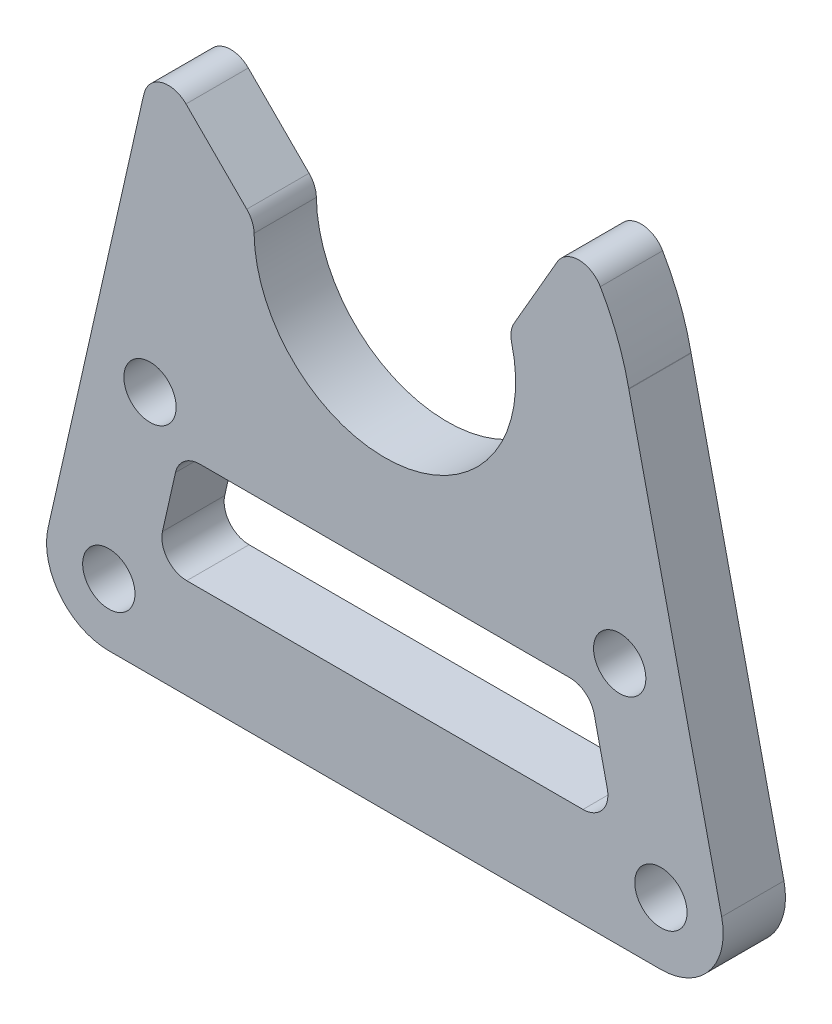
ISO-10303-21;
HEADER;
FILE_DESCRIPTION(('STEP AP214'),'2;1');
FILE_NAME('part.step','',(''),(''),'','','');
FILE_SCHEMA(('AUTOMOTIVE_DESIGN { 1 0 10303 214 1 1 1 1 }'));
ENDSEC;
DATA;
#1=APPLICATION_CONTEXT('core data for automotive mechanical design processes');
#2=APPLICATION_PROTOCOL_DEFINITION('international standard','automotive_design',2000,#1);
#3=PRODUCT_CONTEXT('',#1,'mechanical');
#4=PRODUCT('Part','Part','',(#3));
#5=PRODUCT_RELATED_PRODUCT_CATEGORY('part','',(#4));
#6=PRODUCT_DEFINITION_FORMATION('','',#4);
#7=PRODUCT_DEFINITION_CONTEXT('part definition',#1,'design');
#8=PRODUCT_DEFINITION('design','',#6,#7);
#9=PRODUCT_DEFINITION_SHAPE('','',#8);
#10=(LENGTH_UNIT() NAMED_UNIT(*) SI_UNIT(.MILLI.,.METRE.));
#11=(NAMED_UNIT(*) PLANE_ANGLE_UNIT() SI_UNIT($,.RADIAN.));
#12=(NAMED_UNIT(*) SI_UNIT($,.STERADIAN.) SOLID_ANGLE_UNIT());
#13=UNCERTAINTY_MEASURE_WITH_UNIT(LENGTH_MEASURE(1.E-05),#10,'distance_accuracy_value','');
#14=(GEOMETRIC_REPRESENTATION_CONTEXT(3) GLOBAL_UNCERTAINTY_ASSIGNED_CONTEXT((#13)) GLOBAL_UNIT_ASSIGNED_CONTEXT((#10,
#11,#12)) REPRESENTATION_CONTEXT('',''));
#15=CARTESIAN_POINT('',(0.,0.,0.));
#16=DIRECTION('',(0.,0.,1.));
#17=DIRECTION('',(1.,0.,0.));
#18=AXIS2_PLACEMENT_3D('',#15,#16,#17);
#19=CARTESIAN_POINT('',(0.,0.,5.));
#20=DIRECTION('',(0.,0.,1.));
#21=DIRECTION('',(1.,0.,0.));
#22=AXIS2_PLACEMENT_3D('',#19,#20,#21);
#23=PLANE('',#22);
#24=CARTESIAN_POINT('',(-22.1588204266534,-30.,5.));
#25=DIRECTION('',(0.,0.,1.));
#26=DIRECTION('',(1.,0.,0.));
#27=AXIS2_PLACEMENT_3D('',#24,#25,#26);
#28=CIRCLE('',#27,2.1);
#29=CARTESIAN_POINT('',(-20.0588204266534,-30.,5.));
#30=VERTEX_POINT('',#29);
#31=EDGE_CURVE('E371',#30,#30,#28,.T.);
#32=ORIENTED_EDGE('',*,*,#31,.F.);
#33=EDGE_LOOP('',(#32));
#34=FACE_BOUND('',#33,.T.);
#35=CARTESIAN_POINT('',(-18.850745921435,-15.3693252695604,5.));
#36=DIRECTION('',(0.,0.,1.));
#37=DIRECTION('',(1.,0.,0.));
#38=AXIS2_PLACEMENT_3D('',#35,#36,#37);
#39=CIRCLE('',#38,2.1);
#40=CARTESIAN_POINT('',(-16.750745921435,-15.3693252695604,5.));
#41=VERTEX_POINT('',#40);
#42=EDGE_CURVE('E377',#41,#41,#39,.T.);
#43=ORIENTED_EDGE('',*,*,#42,.F.);
#44=EDGE_LOOP('',(#43));
#45=FACE_BOUND('',#44,.T.);
#46=CARTESIAN_POINT('',(18.8507459214357,-15.3693252695604,5.));
#47=DIRECTION('',(0.,0.,1.));
#48=DIRECTION('',(1.,0.,0.));
#49=AXIS2_PLACEMENT_3D('',#46,#47,#48);
#50=CIRCLE('',#49,2.1);
#51=CARTESIAN_POINT('',(20.9507459214357,-15.3693252695604,5.));
#52=VERTEX_POINT('',#51);
#53=EDGE_CURVE('E355',#52,#52,#50,.T.);
#54=ORIENTED_EDGE('',*,*,#53,.F.);
#55=EDGE_LOOP('',(#54));
#56=FACE_BOUND('',#55,.T.);
#57=DIRECTION('',(-0.220538300347892,-0.975378315362641,0.));
#58=VECTOR('',#57,1.);
#59=CARTESIAN_POINT('',(-18.4047745929788,-27.,5.));
#60=LINE('',#59,#58);
#61=CARTESIAN_POINT('',(-16.8058134570921,-19.9282486688646,5.));
#62=VERTEX_POINT('',#61);
#63=CARTESIAN_POINT('',(-17.8528340012544,-24.5589233993042,5.));
#64=VERTEX_POINT('',#63);
#65=EDGE_CURVE('E326',#62,#64,#60,.T.);
#66=ORIENTED_EDGE('',*,*,#65,.F.);
#67=CARTESIAN_POINT('',(-14.8550568263668,-20.3693252695604,5.));
#68=DIRECTION('',(0.,0.,1.));
#69=DIRECTION('',(1.,0.,0.));
#70=AXIS2_PLACEMENT_3D('',#67,#68,#69);
#71=CIRCLE('',#70,2.);
#72=CARTESIAN_POINT('',(-14.8550568263668,-18.3693252695604,5.));
#73=VERTEX_POINT('',#72);
#74=EDGE_CURVE('E45',#62,#73,#71,.F.);
#75=ORIENTED_EDGE('',*,*,#74,.T.);
#76=DIRECTION('',(-1.,0.,0.));
#77=VECTOR('',#76,1.);
#78=CARTESIAN_POINT('',(-16.4533324643941,-18.3693252695604,5.));
#79=LINE('',#78,#77);
#80=CARTESIAN_POINT('',(14.8550568263675,-18.3693252695604,5.));
#81=VERTEX_POINT('',#80);
#82=EDGE_CURVE('E324',#81,#73,#79,.T.);
#83=ORIENTED_EDGE('',*,*,#82,.F.);
#84=CARTESIAN_POINT('',(14.8550568263675,-20.3693252695604,5.));
#85=DIRECTION('',(0.,0.,1.));
#86=DIRECTION('',(1.,0.,0.));
#87=AXIS2_PLACEMENT_3D('',#84,#85,#86);
#88=CIRCLE('',#87,2.);
#89=CARTESIAN_POINT('',(16.8058134570927,-19.9282486688646,5.));
#90=VERTEX_POINT('',#89);
#91=EDGE_CURVE('E308',#81,#90,#88,.F.);
#92=ORIENTED_EDGE('',*,*,#91,.T.);
#93=DIRECTION('',(-0.220538300347893,0.97537831536264,0.));
#94=VECTOR('',#93,1.);
#95=CARTESIAN_POINT('',(18.4047745929795,-27.,5.));
#96=LINE('',#95,#94);
#97=CARTESIAN_POINT('',(17.852834001255,-24.5589233993042,5.));
#98=VERTEX_POINT('',#97);
#99=EDGE_CURVE('E336',#98,#90,#96,.T.);
#100=ORIENTED_EDGE('',*,*,#99,.F.);
#101=CARTESIAN_POINT('',(15.9020773705297,-25.,5.));
#102=DIRECTION('',(0.,0.,1.));
#103=DIRECTION('',(1.,0.,0.));
#104=AXIS2_PLACEMENT_3D('',#101,#102,#103);
#105=CIRCLE('',#104,2.);
#106=CARTESIAN_POINT('',(15.9020773705297,-27.,5.));
#107=VERTEX_POINT('',#106);
#108=EDGE_CURVE('E312',#98,#107,#105,.F.);
#109=ORIENTED_EDGE('',*,*,#108,.T.);
#110=DIRECTION('',(1.,0.,0.));
#111=VECTOR('',#110,1.);
#112=CARTESIAN_POINT('',(18.4047745929795,-27.,5.));
#113=LINE('',#112,#111);
#114=CARTESIAN_POINT('',(-15.9020773705291,-27.,5.));
#115=VERTEX_POINT('',#114);
#116=EDGE_CURVE('E361',#115,#107,#113,.T.);
#117=ORIENTED_EDGE('',*,*,#116,.F.);
#118=CARTESIAN_POINT('',(-15.9020773705291,-25.,5.));
#119=DIRECTION('',(0.,0.,1.));
#120=DIRECTION('',(1.,0.,0.));
#121=AXIS2_PLACEMENT_3D('',#118,#119,#120);
#122=CIRCLE('',#121,2.);
#123=EDGE_CURVE('E316',#115,#64,#122,.F.);
#124=ORIENTED_EDGE('',*,*,#123,.T.);
#125=EDGE_LOOP('',(#66,#75,#83,#92,#100,#109,#117,#124));
#126=FACE_BOUND('',#125,.T.);
#127=CARTESIAN_POINT('',(22.1588204266541,-30.,5.));
#128=DIRECTION('',(0.,0.,1.));
#129=DIRECTION('',(1.,0.,0.));
#130=AXIS2_PLACEMENT_3D('',#127,#128,#129);
#131=CIRCLE('',#130,2.1);
#132=CARTESIAN_POINT('',(24.2588204266541,-30.,5.));
#133=VERTEX_POINT('',#132);
#134=EDGE_CURVE('E370',#133,#133,#131,.T.);
#135=ORIENTED_EDGE('',*,*,#134,.F.);
#136=EDGE_LOOP('',(#135));
#137=FACE_BOUND('',#136,.T.);
#138=DIRECTION('',(-0.707106781186551,0.707106781186544,0.));
#139=VECTOR('',#138,1.);
#140=CARTESIAN_POINT('',(-4.92499873096428,-4.92499873096433,5.));
#141=LINE('',#140,#139);
#142=CARTESIAN_POINT('',(-11.0844944489594,1.23449698703074,5.));
#143=VERTEX_POINT('',#142);
#144=CARTESIAN_POINT('',(-15.9619542667994,6.11195680487066,5.));
#145=VERTEX_POINT('',#144);
#146=EDGE_CURVE('E475',#143,#145,#141,.T.);
#147=ORIENTED_EDGE('',*,*,#146,.T.);
#148=CARTESIAN_POINT('',(-17.3761678291725,4.69774324249756,5.));
#149=DIRECTION('',(0.,0.,1.));
#150=DIRECTION('',(1.,0.,0.));
#151=AXIS2_PLACEMENT_3D('',#148,#149,#150);
#152=CIRCLE('',#151,2.);
#153=CARTESIAN_POINT('',(-19.306853143525,5.21971471388618,5.));
#154=VERTEX_POINT('',#153);
#155=EDGE_CURVE('E247',#145,#154,#152,.T.);
#156=ORIENTED_EDGE('',*,*,#155,.T.);
#157=CARTESIAN_POINT('',(0.,0.,5.));
#158=DIRECTION('',(0.,0.,1.));
#159=DIRECTION('',(1.,0.,0.));
#160=AXIS2_PLACEMENT_3D('',#157,#158,#159);
#161=CIRCLE('',#160,20.);
#162=CARTESIAN_POINT('',(-19.5767934974094,4.09257331758255,5.));
#163=VERTEX_POINT('',#162);
#164=EDGE_CURVE('E403',#154,#163,#161,.T.);
#165=ORIENTED_EDGE('',*,*,#164,.T.);
#166=CARTESIAN_POINT('',(-21.5344728471503,4.5018306493408,5.));
#167=DIRECTION('',(0.,0.,1.));
#168=DIRECTION('',(1.,0.,0.));
#169=AXIS2_PLACEMENT_3D('',#166,#167,#168);
#170=CIRCLE('',#169,2.);
#171=CARTESIAN_POINT('',(-19.5837162164251,4.06075404864502,5.));
#172=VERTEX_POINT('',#171);
#173=EDGE_CURVE('E301',#163,#172,#170,.F.);
#174=ORIENTED_EDGE('',*,*,#173,.T.);
#175=DIRECTION('',(-0.220538300347892,-0.975378315362641,0.));
#176=VECTOR('',#175,1.);
#177=CARTESIAN_POINT('',(-19.5047220336002,4.41012290133699,5.));
#178=LINE('',#177,#176);
#179=CARTESIAN_POINT('',(-27.0357120034666,-28.8973084982605,5.));
#180=VERTEX_POINT('',#179);
#181=EDGE_CURVE('E386',#172,#180,#178,.T.);
#182=ORIENTED_EDGE('',*,*,#181,.T.);
#183=CARTESIAN_POINT('',(-22.1588204266534,-30.,5.));
#184=DIRECTION('',(0.,0.,1.));
#185=DIRECTION('',(1.,0.,0.));
#186=AXIS2_PLACEMENT_3D('',#183,#184,#185);
#187=CIRCLE('',#186,5.);
#188=CARTESIAN_POINT('',(-22.1588204266534,-35.,5.));
#189=VERTEX_POINT('',#188);
#190=EDGE_CURVE('E408',#180,#189,#187,.T.);
#191=ORIENTED_EDGE('',*,*,#190,.T.);
#192=DIRECTION('',(-1.,0.,0.));
#193=VECTOR('',#192,1.);
#194=CARTESIAN_POINT('',(0.,-35.,5.));
#195=LINE('',#194,#193);
#196=CARTESIAN_POINT('',(22.1588204266541,-35.,5.));
#197=VERTEX_POINT('',#196);
#198=EDGE_CURVE('E208',#197,#189,#195,.T.);
#199=ORIENTED_EDGE('',*,*,#198,.F.);
#200=CARTESIAN_POINT('',(22.1588204266541,-30.,5.));
#201=DIRECTION('',(0.,0.,1.));
#202=DIRECTION('',(1.,0.,0.));
#203=AXIS2_PLACEMENT_3D('',#200,#201,#202);
#204=CIRCLE('',#203,5.);
#205=CARTESIAN_POINT('',(27.0357120034673,-28.8973084982605,5.));
#206=VERTEX_POINT('',#205);
#207=EDGE_CURVE('E231',#197,#206,#204,.T.);
#208=ORIENTED_EDGE('',*,*,#207,.T.);
#209=DIRECTION('',(-0.220538300347893,0.975378315362641,0.));
#210=VECTOR('',#209,1.);
#211=CARTESIAN_POINT('',(19.5047220336008,4.41012290133714,5.));
#212=LINE('',#211,#210);
#213=CARTESIAN_POINT('',(19.5837162164169,4.06075404868399,5.));
#214=VERTEX_POINT('',#213);
#215=EDGE_CURVE('E389',#206,#214,#212,.T.);
#216=ORIENTED_EDGE('',*,*,#215,.T.);
#217=CARTESIAN_POINT('',(21.5344728471422,4.50183064937978,5.));
#218=DIRECTION('',(0.,0.,1.));
#219=DIRECTION('',(1.,0.,0.));
#220=AXIS2_PLACEMENT_3D('',#217,#218,#219);
#221=CIRCLE('',#220,2.);
#222=CARTESIAN_POINT('',(19.576793497402,4.09257331761798,5.));
#223=VERTEX_POINT('',#222);
#224=EDGE_CURVE('E305',#214,#223,#221,.F.);
#225=ORIENTED_EDGE('',*,*,#224,.T.);
#226=CARTESIAN_POINT('',(17.2980264977454,10.0388385425456,5.));
#227=VERTEX_POINT('',#226);
#228=EDGE_CURVE('E213',#223,#227,#161,.T.);
#229=ORIENTED_EDGE('',*,*,#228,.T.);
#230=CARTESIAN_POINT('',(15.5682238479708,9.03495468829103,5.));
#231=DIRECTION('',(0.,0.,1.));
#232=DIRECTION('',(1.,0.,0.));
#233=AXIS2_PLACEMENT_3D('',#230,#231,#232);
#234=CIRCLE('',#233,2.);
#235=CARTESIAN_POINT('',(13.836173040402,10.034954688291,5.));
#236=VERTEX_POINT('',#235);
#237=EDGE_CURVE('E245',#227,#236,#234,.T.);
#238=ORIENTED_EDGE('',*,*,#237,.T.);
#239=DIRECTION('',(0.499999999999998,0.86602540378444,0.));
#240=VECTOR('',#239,1.);
#241=CARTESIAN_POINT('',(6.03186693735862,-3.48249999999998,5.));
#242=LINE('',#241,#240);
#243=CARTESIAN_POINT('',(10.3872881282424,4.06131079097298,5.));
#244=VERTEX_POINT('',#243);
#245=EDGE_CURVE('E478',#244,#236,#242,.T.);
#246=ORIENTED_EDGE('',*,*,#245,.F.);
#247=CARTESIAN_POINT('',(12.1193389358113,3.06131079097299,5.));
#248=DIRECTION('',(0.,0.,1.));
#249=DIRECTION('',(1.,0.,0.));
#250=AXIS2_PLACEMENT_3D('',#247,#248,#249);
#251=CIRCLE('',#250,2.);
#252=CARTESIAN_POINT('',(10.1802447060815,2.57150106441731,5.));
#253=VERTEX_POINT('',#252);
#254=EDGE_CURVE('E243',#244,#253,#251,.T.);
#255=ORIENTED_EDGE('',*,*,#254,.T.);
#256=CARTESIAN_POINT('',(0.,0.,5.));
#257=DIRECTION('',(0.,0.,1.));
#258=DIRECTION('',(1.,0.,0.));
#259=AXIS2_PLACEMENT_3D('',#256,#257,#258);
#260=CIRCLE('',#259,10.5);
#261=CARTESIAN_POINT('',(-10.4989147295193,-0.150961923287583,5.));
#262=VERTEX_POINT('',#261);
#263=EDGE_CURVE('E395',#262,#253,#260,.T.);
#264=ORIENTED_EDGE('',*,*,#263,.F.);
#265=CARTESIAN_POINT('',(-12.4987080113325,-0.17971657534236,5.));
#266=DIRECTION('',(0.,0.,1.));
#267=DIRECTION('',(1.,0.,0.));
#268=AXIS2_PLACEMENT_3D('',#265,#266,#267);
#269=CIRCLE('',#268,2.);
#270=EDGE_CURVE('E241',#262,#143,#269,.T.);
#271=ORIENTED_EDGE('',*,*,#270,.T.);
#272=EDGE_LOOP('',(#147,#156,#165,#174,#182,#191,#199,#208,#216,#225,#229,#238,#246,#255,#264,#271));
#273=FACE_BOUND('',#272,.T.);
#274=ADVANCED_FACE('F37',(#34,#45,#56,#126,#137,#273),#23,.T.);
#275=CARTESIAN_POINT('',(0.,0.,0.));
#276=DIRECTION('',(0.,0.,1.));
#277=DIRECTION('',(1.,0.,0.));
#278=AXIS2_PLACEMENT_3D('',#275,#276,#277);
#279=PLANE('',#278);
#280=CARTESIAN_POINT('',(22.1588204266541,-30.,0.));
#281=DIRECTION('',(0.,0.,1.));
#282=DIRECTION('',(1.,0.,0.));
#283=AXIS2_PLACEMENT_3D('',#280,#281,#282);
#284=CIRCLE('',#283,2.1);
#285=CARTESIAN_POINT('',(24.2588204266541,-30.,0.));
#286=VERTEX_POINT('',#285);
#287=EDGE_CURVE('E381',#286,#286,#284,.T.);
#288=ORIENTED_EDGE('',*,*,#287,.T.);
#289=EDGE_LOOP('',(#288));
#290=FACE_BOUND('',#289,.T.);
#291=DIRECTION('',(-0.220538300347893,0.97537831536264,0.));
#292=VECTOR('',#291,1.);
#293=CARTESIAN_POINT('',(18.4047745929795,-27.,0.));
#294=LINE('',#293,#292);
#295=CARTESIAN_POINT('',(17.852834001255,-24.5589233993042,0.));
#296=VERTEX_POINT('',#295);
#297=CARTESIAN_POINT('',(16.8058134570927,-19.9282486688646,0.));
#298=VERTEX_POINT('',#297);
#299=EDGE_CURVE('E352',#296,#298,#294,.T.);
#300=ORIENTED_EDGE('',*,*,#299,.T.);
#301=CARTESIAN_POINT('',(14.8550568263675,-20.3693252695604,0.));
#302=DIRECTION('',(0.,0.,1.));
#303=DIRECTION('',(1.,0.,0.));
#304=AXIS2_PLACEMENT_3D('',#301,#302,#303);
#305=CIRCLE('',#304,2.);
#306=CARTESIAN_POINT('',(14.8550568263675,-18.3693252695604,0.));
#307=VERTEX_POINT('',#306);
#308=EDGE_CURVE('E310',#298,#307,#305,.T.);
#309=ORIENTED_EDGE('',*,*,#308,.T.);
#310=DIRECTION('',(-1.,0.,0.));
#311=VECTOR('',#310,1.);
#312=CARTESIAN_POINT('',(-16.4533324643941,-18.3693252695604,0.));
#313=LINE('',#312,#311);
#314=CARTESIAN_POINT('',(-14.8550568263668,-18.3693252695604,0.));
#315=VERTEX_POINT('',#314);
#316=EDGE_CURVE('E345',#307,#315,#313,.T.);
#317=ORIENTED_EDGE('',*,*,#316,.T.);
#318=CARTESIAN_POINT('',(-14.8550568263668,-20.3693252695604,0.));
#319=DIRECTION('',(0.,0.,1.));
#320=DIRECTION('',(1.,0.,0.));
#321=AXIS2_PLACEMENT_3D('',#318,#319,#320);
#322=CIRCLE('',#321,2.);
#323=CARTESIAN_POINT('',(-16.8058134570921,-19.9282486688646,0.));
#324=VERTEX_POINT('',#323);
#325=EDGE_CURVE('E11',#315,#324,#322,.T.);
#326=ORIENTED_EDGE('',*,*,#325,.T.);
#327=DIRECTION('',(-0.220538300347892,-0.975378315362641,0.));
#328=VECTOR('',#327,1.);
#329=CARTESIAN_POINT('',(-18.4047745929788,-27.,0.));
#330=LINE('',#329,#328);
#331=CARTESIAN_POINT('',(-17.8528340012544,-24.5589233993042,0.));
#332=VERTEX_POINT('',#331);
#333=EDGE_CURVE('E335',#324,#332,#330,.T.);
#334=ORIENTED_EDGE('',*,*,#333,.T.);
#335=CARTESIAN_POINT('',(-15.9020773705291,-25.,0.));
#336=DIRECTION('',(0.,0.,1.));
#337=DIRECTION('',(1.,0.,0.));
#338=AXIS2_PLACEMENT_3D('',#335,#336,#337);
#339=CIRCLE('',#338,2.);
#340=CARTESIAN_POINT('',(-15.9020773705291,-27.,0.));
#341=VERTEX_POINT('',#340);
#342=EDGE_CURVE('E318',#332,#341,#339,.T.);
#343=ORIENTED_EDGE('',*,*,#342,.T.);
#344=DIRECTION('',(1.,0.,0.));
#345=VECTOR('',#344,1.);
#346=CARTESIAN_POINT('',(18.4047745929795,-27.,0.));
#347=LINE('',#346,#345);
#348=CARTESIAN_POINT('',(15.9020773705297,-27.,0.));
#349=VERTEX_POINT('',#348);
#350=EDGE_CURVE('E349',#341,#349,#347,.T.);
#351=ORIENTED_EDGE('',*,*,#350,.T.);
#352=CARTESIAN_POINT('',(15.9020773705297,-25.,0.));
#353=DIRECTION('',(0.,0.,1.));
#354=DIRECTION('',(1.,0.,0.));
#355=AXIS2_PLACEMENT_3D('',#352,#353,#354);
#356=CIRCLE('',#355,2.);
#357=EDGE_CURVE('E314',#349,#296,#356,.T.);
#358=ORIENTED_EDGE('',*,*,#357,.T.);
#359=EDGE_LOOP('',(#300,#309,#317,#326,#334,#343,#351,#358));
#360=FACE_BOUND('',#359,.T.);
#361=CARTESIAN_POINT('',(18.8507459214357,-15.3693252695604,0.));
#362=DIRECTION('',(0.,0.,1.));
#363=DIRECTION('',(1.,0.,0.));
#364=AXIS2_PLACEMENT_3D('',#361,#362,#363);
#365=CIRCLE('',#364,2.1);
#366=CARTESIAN_POINT('',(20.9507459214357,-15.3693252695604,0.));
#367=VERTEX_POINT('',#366);
#368=EDGE_CURVE('E380',#367,#367,#365,.T.);
#369=ORIENTED_EDGE('',*,*,#368,.T.);
#370=EDGE_LOOP('',(#369));
#371=FACE_BOUND('',#370,.T.);
#372=CARTESIAN_POINT('',(-18.850745921435,-15.3693252695604,0.));
#373=DIRECTION('',(0.,0.,1.));
#374=DIRECTION('',(1.,0.,0.));
#375=AXIS2_PLACEMENT_3D('',#372,#373,#374);
#376=CIRCLE('',#375,2.1);
#377=CARTESIAN_POINT('',(-16.750745921435,-15.3693252695604,0.));
#378=VERTEX_POINT('',#377);
#379=EDGE_CURVE('E374',#378,#378,#376,.T.);
#380=ORIENTED_EDGE('',*,*,#379,.T.);
#381=EDGE_LOOP('',(#380));
#382=FACE_BOUND('',#381,.T.);
#383=CARTESIAN_POINT('',(-22.1588204266534,-30.,0.));
#384=DIRECTION('',(0.,0.,1.));
#385=DIRECTION('',(1.,0.,0.));
#386=AXIS2_PLACEMENT_3D('',#383,#384,#385);
#387=CIRCLE('',#386,2.1);
#388=CARTESIAN_POINT('',(-20.0588204266534,-30.,0.));
#389=VERTEX_POINT('',#388);
#390=EDGE_CURVE('E367',#389,#389,#387,.T.);
#391=ORIENTED_EDGE('',*,*,#390,.T.);
#392=EDGE_LOOP('',(#391));
#393=FACE_BOUND('',#392,.T.);
#394=CARTESIAN_POINT('',(0.,0.,0.));
#395=DIRECTION('',(0.,0.,1.));
#396=DIRECTION('',(1.,0.,0.));
#397=AXIS2_PLACEMENT_3D('',#394,#395,#396);
#398=CIRCLE('',#397,20.);
#399=CARTESIAN_POINT('',(-19.306853143525,5.21971471388618,0.));
#400=VERTEX_POINT('',#399);
#401=CARTESIAN_POINT('',(-19.5767934974094,4.09257331758255,0.));
#402=VERTEX_POINT('',#401);
#403=EDGE_CURVE('E398',#400,#402,#398,.T.);
#404=ORIENTED_EDGE('',*,*,#403,.F.);
#405=CARTESIAN_POINT('',(-17.3761678291725,4.69774324249756,0.));
#406=DIRECTION('',(0.,0.,1.));
#407=DIRECTION('',(1.,0.,0.));
#408=AXIS2_PLACEMENT_3D('',#405,#406,#407);
#409=CIRCLE('',#408,2.);
#410=CARTESIAN_POINT('',(-15.9619542667994,6.11195680487066,0.));
#411=VERTEX_POINT('',#410);
#412=EDGE_CURVE('E260',#400,#411,#409,.F.);
#413=ORIENTED_EDGE('',*,*,#412,.T.);
#414=DIRECTION('',(-0.707106781186551,0.707106781186544,0.));
#415=VECTOR('',#414,1.);
#416=CARTESIAN_POINT('',(-4.92499873096428,-4.92499873096433,0.));
#417=LINE('',#416,#415);
#418=CARTESIAN_POINT('',(-11.0844944489594,1.23449698703074,0.));
#419=VERTEX_POINT('',#418);
#420=EDGE_CURVE('E362',#419,#411,#417,.T.);
#421=ORIENTED_EDGE('',*,*,#420,.F.);
#422=CARTESIAN_POINT('',(-12.4987080113325,-0.17971657534236,0.));
#423=DIRECTION('',(0.,0.,1.));
#424=DIRECTION('',(1.,0.,0.));
#425=AXIS2_PLACEMENT_3D('',#422,#423,#424);
#426=CIRCLE('',#425,2.);
#427=CARTESIAN_POINT('',(-10.4989147295193,-0.150961923287583,0.));
#428=VERTEX_POINT('',#427);
#429=EDGE_CURVE('E254',#419,#428,#426,.F.);
#430=ORIENTED_EDGE('',*,*,#429,.T.);
#431=CARTESIAN_POINT('',(0.,0.,0.));
#432=DIRECTION('',(0.,0.,1.));
#433=DIRECTION('',(1.,0.,0.));
#434=AXIS2_PLACEMENT_3D('',#431,#432,#433);
#435=CIRCLE('',#434,10.5);
#436=CARTESIAN_POINT('',(10.1802447060815,2.57150106441731,0.));
#437=VERTEX_POINT('',#436);
#438=EDGE_CURVE('E394',#428,#437,#435,.T.);
#439=ORIENTED_EDGE('',*,*,#438,.T.);
#440=CARTESIAN_POINT('',(12.1193389358113,3.06131079097299,0.));
#441=DIRECTION('',(0.,0.,1.));
#442=DIRECTION('',(1.,0.,0.));
#443=AXIS2_PLACEMENT_3D('',#440,#441,#442);
#444=CIRCLE('',#443,2.);
#445=CARTESIAN_POINT('',(10.3872881282424,4.06131079097298,0.));
#446=VERTEX_POINT('',#445);
#447=EDGE_CURVE('E256',#437,#446,#444,.F.);
#448=ORIENTED_EDGE('',*,*,#447,.T.);
#449=DIRECTION('',(0.499999999999998,0.86602540378444,0.));
#450=VECTOR('',#449,1.);
#451=CARTESIAN_POINT('',(6.03186693735862,-3.48249999999998,0.));
#452=LINE('',#451,#450);
#453=CARTESIAN_POINT('',(13.836173040402,10.034954688291,0.));
#454=VERTEX_POINT('',#453);
#455=EDGE_CURVE('E472',#446,#454,#452,.T.);
#456=ORIENTED_EDGE('',*,*,#455,.T.);
#457=CARTESIAN_POINT('',(15.5682238479708,9.03495468829103,0.));
#458=DIRECTION('',(0.,0.,1.));
#459=DIRECTION('',(1.,0.,0.));
#460=AXIS2_PLACEMENT_3D('',#457,#458,#459);
#461=CIRCLE('',#460,2.);
#462=CARTESIAN_POINT('',(17.2980264977454,10.0388385425456,0.));
#463=VERTEX_POINT('',#462);
#464=EDGE_CURVE('E258',#454,#463,#461,.F.);
#465=ORIENTED_EDGE('',*,*,#464,.T.);
#466=CARTESIAN_POINT('',(19.576793497402,4.09257331761798,0.));
#467=VERTEX_POINT('',#466);
#468=EDGE_CURVE('E404',#467,#463,#398,.T.);
#469=ORIENTED_EDGE('',*,*,#468,.F.);
#470=CARTESIAN_POINT('',(21.5344728471422,4.50183064937978,0.));
#471=DIRECTION('',(0.,0.,1.));
#472=DIRECTION('',(1.,0.,0.));
#473=AXIS2_PLACEMENT_3D('',#470,#471,#472);
#474=CIRCLE('',#473,2.);
#475=CARTESIAN_POINT('',(19.5837162164169,4.06075404868399,0.));
#476=VERTEX_POINT('',#475);
#477=EDGE_CURVE('E60',#467,#476,#474,.T.);
#478=ORIENTED_EDGE('',*,*,#477,.T.);
#479=DIRECTION('',(0.220538300347893,-0.975378315362641,0.));
#480=VECTOR('',#479,1.);
#481=CARTESIAN_POINT('',(19.5047220336008,4.41012290133714,0.));
#482=LINE('',#481,#480);
#483=CARTESIAN_POINT('',(27.0357120034673,-28.8973084982605,0.));
#484=VERTEX_POINT('',#483);
#485=EDGE_CURVE('E220',#476,#484,#482,.T.);
#486=ORIENTED_EDGE('',*,*,#485,.T.);
#487=CARTESIAN_POINT('',(22.1588204266541,-30.,0.));
#488=DIRECTION('',(0.,0.,1.));
#489=DIRECTION('',(1.,0.,0.));
#490=AXIS2_PLACEMENT_3D('',#487,#488,#489);
#491=CIRCLE('',#490,5.);
#492=CARTESIAN_POINT('',(22.1588204266541,-35.,0.));
#493=VERTEX_POINT('',#492);
#494=EDGE_CURVE('E219',#484,#493,#491,.F.);
#495=ORIENTED_EDGE('',*,*,#494,.T.);
#496=DIRECTION('',(1.,0.,0.));
#497=VECTOR('',#496,1.);
#498=CARTESIAN_POINT('',(0.,-35.,0.));
#499=LINE('',#498,#497);
#500=CARTESIAN_POINT('',(-22.1588204266534,-35.,0.));
#501=VERTEX_POINT('',#500);
#502=EDGE_CURVE('E205',#501,#493,#499,.T.);
#503=ORIENTED_EDGE('',*,*,#502,.F.);
#504=CARTESIAN_POINT('',(-22.1588204266534,-30.,0.));
#505=DIRECTION('',(0.,0.,1.));
#506=DIRECTION('',(1.,0.,0.));
#507=AXIS2_PLACEMENT_3D('',#504,#505,#506);
#508=CIRCLE('',#507,5.);
#509=CARTESIAN_POINT('',(-27.0357120034666,-28.8973084982605,0.));
#510=VERTEX_POINT('',#509);
#511=EDGE_CURVE('E217',#501,#510,#508,.F.);
#512=ORIENTED_EDGE('',*,*,#511,.T.);
#513=DIRECTION('',(0.220538300347892,0.975378315362641,0.));
#514=VECTOR('',#513,1.);
#515=CARTESIAN_POINT('',(-19.5047220336002,4.41012290133699,0.));
#516=LINE('',#515,#514);
#517=CARTESIAN_POINT('',(-19.5837162164251,4.06075404864502,0.));
#518=VERTEX_POINT('',#517);
#519=EDGE_CURVE('E221',#510,#518,#516,.T.);
#520=ORIENTED_EDGE('',*,*,#519,.T.);
#521=CARTESIAN_POINT('',(-21.5344728471503,4.5018306493408,0.));
#522=DIRECTION('',(0.,0.,1.));
#523=DIRECTION('',(1.,0.,0.));
#524=AXIS2_PLACEMENT_3D('',#521,#522,#523);
#525=CIRCLE('',#524,2.);
#526=EDGE_CURVE('E303',#518,#402,#525,.T.);
#527=ORIENTED_EDGE('',*,*,#526,.T.);
#528=EDGE_LOOP('',(#404,#413,#421,#430,#439,#448,#456,#465,#469,#478,#486,#495,#503,#512,#520,#527));
#529=FACE_BOUND('',#528,.T.);
#530=ADVANCED_FACE('F216',(#290,#360,#371,#382,#393,#529),#279,.F.);
#531=CARTESIAN_POINT('',(0.,0.,5.));
#532=DIRECTION('',(0.,0.,-1.));
#533=DIRECTION('',(-1.,0.,0.));
#534=AXIS2_PLACEMENT_3D('',#531,#532,#533);
#535=CYLINDRICAL_SURFACE('',#534,20.);
#536=ORIENTED_EDGE('',*,*,#164,.F.);
#537=DIRECTION('',(0.,0.,-1.));
#538=VECTOR('',#537,1.);
#539=CARTESIAN_POINT('',(-19.306853143525,5.21971471388618,5.));
#540=LINE('',#539,#538);
#541=EDGE_CURVE('E252',#154,#400,#540,.T.);
#542=ORIENTED_EDGE('',*,*,#541,.T.);
#543=ORIENTED_EDGE('',*,*,#403,.T.);
#544=DIRECTION('',(0.,0.,-1.));
#545=VECTOR('',#544,1.);
#546=CARTESIAN_POINT('',(-19.5767934974094,4.09257331758255,5.));
#547=LINE('',#546,#545);
#548=EDGE_CURVE('E249',#402,#163,#547,.F.);
#549=ORIENTED_EDGE('',*,*,#548,.T.);
#550=EDGE_LOOP('',(#536,#542,#543,#549));
#551=FACE_BOUND('',#550,.T.);
#552=ADVANCED_FACE('F435',(#551),#535,.T.);
#553=CARTESIAN_POINT('',(0.,0.,5.));
#554=DIRECTION('',(0.,0.,-1.));
#555=DIRECTION('',(-1.,0.,0.));
#556=AXIS2_PLACEMENT_3D('',#553,#554,#555);
#557=CYLINDRICAL_SURFACE('',#556,10.5);
#558=ORIENTED_EDGE('',*,*,#263,.T.);
#559=DIRECTION('',(0.,0.,-1.));
#560=VECTOR('',#559,1.);
#561=CARTESIAN_POINT('',(10.1802447060815,2.57150106441731,5.));
#562=LINE('',#561,#560);
#563=EDGE_CURVE('E279',#253,#437,#562,.T.);
#564=ORIENTED_EDGE('',*,*,#563,.T.);
#565=ORIENTED_EDGE('',*,*,#438,.F.);
#566=DIRECTION('',(0.,0.,-1.));
#567=VECTOR('',#566,1.);
#568=CARTESIAN_POINT('',(-10.4989147295193,-0.150961923287583,5.));
#569=LINE('',#568,#567);
#570=EDGE_CURVE('E276',#428,#262,#569,.F.);
#571=ORIENTED_EDGE('',*,*,#570,.T.);
#572=EDGE_LOOP('',(#558,#564,#565,#571));
#573=FACE_BOUND('',#572,.T.);
#574=ADVANCED_FACE('F441',(#573),#557,.F.);
#575=ORIENTED_EDGE('',*,*,#228,.F.);
#576=DIRECTION('',(0.,0.,-1.));
#577=VECTOR('',#576,1.);
#578=CARTESIAN_POINT('',(19.576793497402,4.09257331761798,5.));
#579=LINE('',#578,#577);
#580=EDGE_CURVE('E269',#223,#467,#579,.T.);
#581=ORIENTED_EDGE('',*,*,#580,.T.);
#582=ORIENTED_EDGE('',*,*,#468,.T.);
#583=DIRECTION('',(0.,0.,-1.));
#584=VECTOR('',#583,1.);
#585=CARTESIAN_POINT('',(17.2980264977454,10.0388385425456,5.));
#586=LINE('',#585,#584);
#587=EDGE_CURVE('E266',#463,#227,#586,.F.);
#588=ORIENTED_EDGE('',*,*,#587,.T.);
#589=EDGE_LOOP('',(#575,#581,#582,#588));
#590=FACE_BOUND('',#589,.T.);
#591=ADVANCED_FACE('F443',(#590),#535,.T.);
#592=CARTESIAN_POINT('',(0.,-35.,-68.9694860464731));
#593=DIRECTION('',(0.,1.,0.));
#594=DIRECTION('',(-1.,0.,0.));
#595=AXIS2_PLACEMENT_3D('',#592,#593,#594);
#596=PLANE('',#595);
#597=ORIENTED_EDGE('',*,*,#502,.T.);
#598=DIRECTION('',(0.,0.,1.));
#599=VECTOR('',#598,1.);
#600=CARTESIAN_POINT('',(22.1588204266541,-35.,5.));
#601=LINE('',#600,#599);
#602=EDGE_CURVE('E212',#493,#197,#601,.T.);
#603=ORIENTED_EDGE('',*,*,#602,.T.);
#604=ORIENTED_EDGE('',*,*,#198,.T.);
#605=DIRECTION('',(0.,0.,1.));
#606=VECTOR('',#605,1.);
#607=CARTESIAN_POINT('',(-22.1588204266534,-35.,0.));
#608=LINE('',#607,#606);
#609=EDGE_CURVE('E201',#189,#501,#608,.F.);
#610=ORIENTED_EDGE('',*,*,#609,.T.);
#611=EDGE_LOOP('',(#597,#603,#604,#610));
#612=FACE_BOUND('',#611,.T.);
#613=ADVANCED_FACE('F203',(#612),#596,.F.);
#614=CARTESIAN_POINT('',(-19.5047220336002,4.41012290133699,-68.9694860464731));
#615=DIRECTION('',(-0.975378315362641,0.220538300347892,0.));
#616=DIRECTION('',(-0.220538300347892,-0.975378315362641,0.));
#617=AXIS2_PLACEMENT_3D('',#614,#615,#616);
#618=PLANE('',#617);
#619=ORIENTED_EDGE('',*,*,#181,.F.);
#620=DIRECTION('',(0.,0.,-1.));
#621=VECTOR('',#620,1.);
#622=CARTESIAN_POINT('',(-19.5837162164251,4.06075404864502,-68.9694860464731));
#623=LINE('',#622,#621);
#624=EDGE_CURVE('E52',#172,#518,#623,.T.);
#625=ORIENTED_EDGE('',*,*,#624,.T.);
#626=ORIENTED_EDGE('',*,*,#519,.F.);
#627=DIRECTION('',(0.,0.,1.));
#628=VECTOR('',#627,1.);
#629=CARTESIAN_POINT('',(-27.0357120034666,-28.8973084982605,5.));
#630=LINE('',#629,#628);
#631=EDGE_CURVE('E226',#510,#180,#630,.T.);
#632=ORIENTED_EDGE('',*,*,#631,.T.);
#633=EDGE_LOOP('',(#619,#625,#626,#632));
#634=FACE_BOUND('',#633,.T.);
#635=ADVANCED_FACE('F426',(#634),#618,.T.);
#636=CARTESIAN_POINT('',(19.5047220336008,4.41012290133714,-68.9694860464731));
#637=DIRECTION('',(0.975378315362641,0.220538300347893,0.));
#638=DIRECTION('',(-0.220538300347893,0.975378315362641,0.));
#639=AXIS2_PLACEMENT_3D('',#636,#637,#638);
#640=PLANE('',#639);
#641=ORIENTED_EDGE('',*,*,#485,.F.);
#642=DIRECTION('',(0.,0.,-1.));
#643=VECTOR('',#642,1.);
#644=CARTESIAN_POINT('',(19.5837162164169,4.06075404868399,-68.9694860464731));
#645=LINE('',#644,#643);
#646=EDGE_CURVE('E263',#476,#214,#645,.F.);
#647=ORIENTED_EDGE('',*,*,#646,.T.);
#648=ORIENTED_EDGE('',*,*,#215,.F.);
#649=DIRECTION('',(0.,0.,1.));
#650=VECTOR('',#649,1.);
#651=CARTESIAN_POINT('',(27.0357120034673,-28.8973084982605,0.));
#652=LINE('',#651,#650);
#653=EDGE_CURVE('E227',#206,#484,#652,.F.);
#654=ORIENTED_EDGE('',*,*,#653,.T.);
#655=EDGE_LOOP('',(#641,#647,#648,#654));
#656=FACE_BOUND('',#655,.T.);
#657=ADVANCED_FACE('F415',(#656),#640,.T.);
#658=CARTESIAN_POINT('',(22.1588204266541,-30.,-68.9694860464731));
#659=DIRECTION('',(0.,0.,-1.));
#660=DIRECTION('',(-1.,0.,0.));
#661=AXIS2_PLACEMENT_3D('',#658,#659,#660);
#662=CYLINDRICAL_SURFACE('',#661,5.);
#663=ORIENTED_EDGE('',*,*,#494,.F.);
#664=ORIENTED_EDGE('',*,*,#653,.F.);
#665=ORIENTED_EDGE('',*,*,#207,.F.);
#666=ORIENTED_EDGE('',*,*,#602,.F.);
#667=EDGE_LOOP('',(#663,#664,#665,#666));
#668=FACE_BOUND('',#667,.T.);
#669=ADVANCED_FACE('F417',(#668),#662,.T.);
#670=CARTESIAN_POINT('',(-22.1588204266534,-30.,-68.9694860464731));
#671=DIRECTION('',(0.,0.,-1.));
#672=DIRECTION('',(-1.,0.,0.));
#673=AXIS2_PLACEMENT_3D('',#670,#671,#672);
#674=CYLINDRICAL_SURFACE('',#673,5.);
#675=ORIENTED_EDGE('',*,*,#511,.F.);
#676=ORIENTED_EDGE('',*,*,#609,.F.);
#677=ORIENTED_EDGE('',*,*,#190,.F.);
#678=ORIENTED_EDGE('',*,*,#631,.F.);
#679=EDGE_LOOP('',(#675,#676,#677,#678));
#680=FACE_BOUND('',#679,.T.);
#681=ADVANCED_FACE('F224',(#680),#674,.T.);
#682=CARTESIAN_POINT('',(22.1588204266541,-30.,0.));
#683=DIRECTION('',(0.,0.,1.));
#684=DIRECTION('',(1.,0.,0.));
#685=AXIS2_PLACEMENT_3D('',#682,#683,#684);
#686=CYLINDRICAL_SURFACE('',#685,2.1);
#687=ORIENTED_EDGE('',*,*,#287,.F.);
#688=EDGE_LOOP('',(#687));
#689=FACE_BOUND('',#688,.T.);
#690=ORIENTED_EDGE('',*,*,#134,.T.);
#691=EDGE_LOOP('',(#690));
#692=FACE_BOUND('',#691,.T.);
#693=ADVANCED_FACE('F424',(#689,#692),#686,.F.);
#694=CARTESIAN_POINT('',(-18.4047745929788,-27.,0.));
#695=DIRECTION('',(-0.975378315362641,0.220538300347892,0.));
#696=DIRECTION('',(-0.220538300347892,-0.975378315362641,0.));
#697=AXIS2_PLACEMENT_3D('',#694,#695,#696);
#698=PLANE('',#697);
#699=ORIENTED_EDGE('',*,*,#65,.T.);
#700=DIRECTION('',(0.,0.,1.));
#701=VECTOR('',#700,1.);
#702=CARTESIAN_POINT('',(-17.8528340012544,-24.5589233993042,0.));
#703=LINE('',#702,#701);
#704=EDGE_CURVE('E299',#64,#332,#703,.F.);
#705=ORIENTED_EDGE('',*,*,#704,.T.);
#706=ORIENTED_EDGE('',*,*,#333,.F.);
#707=DIRECTION('',(0.,0.,1.));
#708=VECTOR('',#707,1.);
#709=CARTESIAN_POINT('',(-16.8058134570921,-19.9282486688646,5.));
#710=LINE('',#709,#708);
#711=EDGE_CURVE('E296',#324,#62,#710,.T.);
#712=ORIENTED_EDGE('',*,*,#711,.T.);
#713=EDGE_LOOP('',(#699,#705,#706,#712));
#714=FACE_BOUND('',#713,.T.);
#715=ADVANCED_FACE('F347',(#714),#698,.F.);
#716=CARTESIAN_POINT('',(-16.4533324643941,-18.3693252695604,0.));
#717=DIRECTION('',(0.,1.,0.));
#718=DIRECTION('',(0.,0.,1.));
#719=AXIS2_PLACEMENT_3D('',#716,#717,#718);
#720=PLANE('',#719);
#721=ORIENTED_EDGE('',*,*,#316,.F.);
#722=DIRECTION('',(0.,0.,1.));
#723=VECTOR('',#722,1.);
#724=CARTESIAN_POINT('',(14.8550568263675,-18.3693252695604,5.));
#725=LINE('',#724,#723);
#726=EDGE_CURVE('E283',#307,#81,#725,.T.);
#727=ORIENTED_EDGE('',*,*,#726,.T.);
#728=ORIENTED_EDGE('',*,*,#82,.T.);
#729=DIRECTION('',(0.,0.,1.));
#730=VECTOR('',#729,1.);
#731=CARTESIAN_POINT('',(-14.8550568263668,-18.3693252695604,0.));
#732=LINE('',#731,#730);
#733=EDGE_CURVE('E281',#73,#315,#732,.F.);
#734=ORIENTED_EDGE('',*,*,#733,.T.);
#735=EDGE_LOOP('',(#721,#727,#728,#734));
#736=FACE_BOUND('',#735,.T.);
#737=ADVANCED_FACE('F332',(#736),#720,.F.);
#738=CARTESIAN_POINT('',(18.4047745929795,-27.,0.));
#739=DIRECTION('',(0.975378315362641,0.220538300347893,0.));
#740=DIRECTION('',(-0.220538300347893,0.975378315362641,0.));
#741=AXIS2_PLACEMENT_3D('',#738,#739,#740);
#742=PLANE('',#741);
#743=ORIENTED_EDGE('',*,*,#99,.T.);
#744=DIRECTION('',(0.,0.,1.));
#745=VECTOR('',#744,1.);
#746=CARTESIAN_POINT('',(16.8058134570927,-19.9282486688646,0.));
#747=LINE('',#746,#745);
#748=EDGE_CURVE('E289',#90,#298,#747,.F.);
#749=ORIENTED_EDGE('',*,*,#748,.T.);
#750=ORIENTED_EDGE('',*,*,#299,.F.);
#751=DIRECTION('',(0.,0.,1.));
#752=VECTOR('',#751,1.);
#753=CARTESIAN_POINT('',(17.852834001255,-24.5589233993042,5.));
#754=LINE('',#753,#752);
#755=EDGE_CURVE('E286',#296,#98,#754,.T.);
#756=ORIENTED_EDGE('',*,*,#755,.T.);
#757=EDGE_LOOP('',(#743,#749,#750,#756));
#758=FACE_BOUND('',#757,.T.);
#759=ADVANCED_FACE('F500',(#758),#742,.F.);
#760=CARTESIAN_POINT('',(18.4047745929795,-27.,0.));
#761=DIRECTION('',(0.,-1.,0.));
#762=DIRECTION('',(0.,0.,-1.));
#763=AXIS2_PLACEMENT_3D('',#760,#761,#762);
#764=PLANE('',#763);
#765=ORIENTED_EDGE('',*,*,#116,.T.);
#766=DIRECTION('',(0.,0.,1.));
#767=VECTOR('',#766,1.);
#768=CARTESIAN_POINT('',(15.9020773705297,-27.,0.));
#769=LINE('',#768,#767);
#770=EDGE_CURVE('E294',#107,#349,#769,.F.);
#771=ORIENTED_EDGE('',*,*,#770,.T.);
#772=ORIENTED_EDGE('',*,*,#350,.F.);
#773=DIRECTION('',(0.,0.,1.));
#774=VECTOR('',#773,1.);
#775=CARTESIAN_POINT('',(-15.9020773705291,-27.,5.));
#776=LINE('',#775,#774);
#777=EDGE_CURVE('E291',#341,#115,#776,.T.);
#778=ORIENTED_EDGE('',*,*,#777,.T.);
#779=EDGE_LOOP('',(#765,#771,#772,#778));
#780=FACE_BOUND('',#779,.T.);
#781=ADVANCED_FACE('F490',(#780),#764,.F.);
#782=CARTESIAN_POINT('',(18.8507459214357,-15.3693252695604,0.));
#783=DIRECTION('',(0.,0.,1.));
#784=DIRECTION('',(1.,0.,0.));
#785=AXIS2_PLACEMENT_3D('',#782,#783,#784);
#786=CYLINDRICAL_SURFACE('',#785,2.1);
#787=ORIENTED_EDGE('',*,*,#368,.F.);
#788=EDGE_LOOP('',(#787));
#789=FACE_BOUND('',#788,.T.);
#790=ORIENTED_EDGE('',*,*,#53,.T.);
#791=EDGE_LOOP('',(#790));
#792=FACE_BOUND('',#791,.T.);
#793=ADVANCED_FACE('F486',(#789,#792),#786,.F.);
#794=CARTESIAN_POINT('',(-18.850745921435,-15.3693252695604,0.));
#795=DIRECTION('',(0.,0.,1.));
#796=DIRECTION('',(1.,0.,0.));
#797=AXIS2_PLACEMENT_3D('',#794,#795,#796);
#798=CYLINDRICAL_SURFACE('',#797,2.1);
#799=ORIENTED_EDGE('',*,*,#379,.F.);
#800=EDGE_LOOP('',(#799));
#801=FACE_BOUND('',#800,.T.);
#802=ORIENTED_EDGE('',*,*,#42,.T.);
#803=EDGE_LOOP('',(#802));
#804=FACE_BOUND('',#803,.T.);
#805=ADVANCED_FACE('F489',(#801,#804),#798,.F.);
#806=CARTESIAN_POINT('',(-22.1588204266534,-30.,0.));
#807=DIRECTION('',(0.,0.,1.));
#808=DIRECTION('',(1.,0.,0.));
#809=AXIS2_PLACEMENT_3D('',#806,#807,#808);
#810=CYLINDRICAL_SURFACE('',#809,2.1);
#811=ORIENTED_EDGE('',*,*,#390,.F.);
#812=EDGE_LOOP('',(#811));
#813=FACE_BOUND('',#812,.T.);
#814=ORIENTED_EDGE('',*,*,#31,.T.);
#815=EDGE_LOOP('',(#814));
#816=FACE_BOUND('',#815,.T.);
#817=ADVANCED_FACE('F497',(#813,#816),#810,.F.);
#818=CARTESIAN_POINT('',(6.03186693735862,-3.48249999999998,0.));
#819=DIRECTION('',(0.86602540378444,-0.499999999999998,0.));
#820=DIRECTION('',(0.499999999999998,0.86602540378444,0.));
#821=AXIS2_PLACEMENT_3D('',#818,#819,#820);
#822=PLANE('',#821);
#823=ORIENTED_EDGE('',*,*,#245,.T.);
#824=DIRECTION('',(0.,0.,-1.));
#825=VECTOR('',#824,1.);
#826=CARTESIAN_POINT('',(13.836173040402,10.034954688291,0.));
#827=LINE('',#826,#825);
#828=EDGE_CURVE('E274',#236,#454,#827,.T.);
#829=ORIENTED_EDGE('',*,*,#828,.T.);
#830=ORIENTED_EDGE('',*,*,#455,.F.);
#831=DIRECTION('',(0.,0.,1.));
#832=VECTOR('',#831,1.);
#833=CARTESIAN_POINT('',(10.3872881282424,4.06131079097298,5.));
#834=LINE('',#833,#832);
#835=EDGE_CURVE('E271',#446,#244,#834,.T.);
#836=ORIENTED_EDGE('',*,*,#835,.T.);
#837=EDGE_LOOP('',(#823,#829,#830,#836));
#838=FACE_BOUND('',#837,.T.);
#839=ADVANCED_FACE('F505',(#838),#822,.F.);
#840=CARTESIAN_POINT('',(-4.92499873096428,-4.92499873096433,0.));
#841=DIRECTION('',(0.707106781186544,0.707106781186551,0.));
#842=DIRECTION('',(-0.707106781186551,0.707106781186544,0.));
#843=AXIS2_PLACEMENT_3D('',#840,#841,#842);
#844=PLANE('',#843);
#845=ORIENTED_EDGE('',*,*,#420,.T.);
#846=DIRECTION('',(0.,0.,1.));
#847=VECTOR('',#846,1.);
#848=CARTESIAN_POINT('',(-15.9619542667994,6.11195680487066,5.));
#849=LINE('',#848,#847);
#850=EDGE_CURVE('E238',#411,#145,#849,.T.);
#851=ORIENTED_EDGE('',*,*,#850,.T.);
#852=ORIENTED_EDGE('',*,*,#146,.F.);
#853=DIRECTION('',(0.,0.,-1.));
#854=VECTOR('',#853,1.);
#855=CARTESIAN_POINT('',(-11.0844944489594,1.23449698703074,0.));
#856=LINE('',#855,#854);
#857=EDGE_CURVE('E236',#143,#419,#856,.T.);
#858=ORIENTED_EDGE('',*,*,#857,.T.);
#859=EDGE_LOOP('',(#845,#851,#852,#858));
#860=FACE_BOUND('',#859,.T.);
#861=ADVANCED_FACE('F469',(#860),#844,.T.);
#862=CARTESIAN_POINT('',(-17.3761678291725,4.69774324249756,5.));
#863=DIRECTION('',(0.,0.,-1.));
#864=DIRECTION('',(-1.,0.,0.));
#865=AXIS2_PLACEMENT_3D('',#862,#863,#864);
#866=CYLINDRICAL_SURFACE('',#865,2.);
#867=ORIENTED_EDGE('',*,*,#412,.F.);
#868=ORIENTED_EDGE('',*,*,#541,.F.);
#869=ORIENTED_EDGE('',*,*,#155,.F.);
#870=ORIENTED_EDGE('',*,*,#850,.F.);
#871=EDGE_LOOP('',(#867,#868,#869,#870));
#872=FACE_BOUND('',#871,.T.);
#873=ADVANCED_FACE('F463',(#872),#866,.T.);
#874=CARTESIAN_POINT('',(-21.5344728471503,4.5018306493408,5.));
#875=DIRECTION('',(0.,0.,-1.));
#876=DIRECTION('',(-1.,0.,0.));
#877=AXIS2_PLACEMENT_3D('',#874,#875,#876);
#878=CYLINDRICAL_SURFACE('',#877,2.);
#879=ORIENTED_EDGE('',*,*,#526,.F.);
#880=ORIENTED_EDGE('',*,*,#624,.F.);
#881=ORIENTED_EDGE('',*,*,#173,.F.);
#882=ORIENTED_EDGE('',*,*,#548,.F.);
#883=EDGE_LOOP('',(#879,#880,#881,#882));
#884=FACE_BOUND('',#883,.T.);
#885=ADVANCED_FACE('F525',(#884),#878,.F.);
#886=CARTESIAN_POINT('',(21.5344728471422,4.50183064937978,5.));
#887=DIRECTION('',(0.,0.,-1.));
#888=DIRECTION('',(-1.,0.,0.));
#889=AXIS2_PLACEMENT_3D('',#886,#887,#888);
#890=CYLINDRICAL_SURFACE('',#889,2.);
#891=ORIENTED_EDGE('',*,*,#477,.F.);
#892=ORIENTED_EDGE('',*,*,#580,.F.);
#893=ORIENTED_EDGE('',*,*,#224,.F.);
#894=ORIENTED_EDGE('',*,*,#646,.F.);
#895=EDGE_LOOP('',(#891,#892,#893,#894));
#896=FACE_BOUND('',#895,.T.);
#897=ADVANCED_FACE('F527',(#896),#890,.F.);
#898=CARTESIAN_POINT('',(15.5682238479708,9.03495468829103,5.));
#899=DIRECTION('',(0.,0.,-1.));
#900=DIRECTION('',(-1.,0.,0.));
#901=AXIS2_PLACEMENT_3D('',#898,#899,#900);
#902=CYLINDRICAL_SURFACE('',#901,2.);
#903=ORIENTED_EDGE('',*,*,#464,.F.);
#904=ORIENTED_EDGE('',*,*,#828,.F.);
#905=ORIENTED_EDGE('',*,*,#237,.F.);
#906=ORIENTED_EDGE('',*,*,#587,.F.);
#907=EDGE_LOOP('',(#903,#904,#905,#906));
#908=FACE_BOUND('',#907,.T.);
#909=ADVANCED_FACE('F533',(#908),#902,.T.);
#910=CARTESIAN_POINT('',(12.1193389358113,3.06131079097299,5.));
#911=DIRECTION('',(0.,0.,-1.));
#912=DIRECTION('',(-1.,0.,0.));
#913=AXIS2_PLACEMENT_3D('',#910,#911,#912);
#914=CYLINDRICAL_SURFACE('',#913,2.);
#915=ORIENTED_EDGE('',*,*,#447,.F.);
#916=ORIENTED_EDGE('',*,*,#563,.F.);
#917=ORIENTED_EDGE('',*,*,#254,.F.);
#918=ORIENTED_EDGE('',*,*,#835,.F.);
#919=EDGE_LOOP('',(#915,#916,#917,#918));
#920=FACE_BOUND('',#919,.T.);
#921=ADVANCED_FACE('F540',(#920),#914,.T.);
#922=CARTESIAN_POINT('',(-12.4987080113325,-0.17971657534236,5.));
#923=DIRECTION('',(0.,0.,-1.));
#924=DIRECTION('',(-1.,0.,0.));
#925=AXIS2_PLACEMENT_3D('',#922,#923,#924);
#926=CYLINDRICAL_SURFACE('',#925,2.);
#927=ORIENTED_EDGE('',*,*,#429,.F.);
#928=ORIENTED_EDGE('',*,*,#857,.F.);
#929=ORIENTED_EDGE('',*,*,#270,.F.);
#930=ORIENTED_EDGE('',*,*,#570,.F.);
#931=EDGE_LOOP('',(#927,#928,#929,#930));
#932=FACE_BOUND('',#931,.T.);
#933=ADVANCED_FACE('F544',(#932),#926,.T.);
#934=CARTESIAN_POINT('',(14.8550568263675,-20.3693252695604,0.));
#935=DIRECTION('',(0.,0.,-1.));
#936=DIRECTION('',(-1.,0.,0.));
#937=AXIS2_PLACEMENT_3D('',#934,#935,#936);
#938=CYLINDRICAL_SURFACE('',#937,2.);
#939=ORIENTED_EDGE('',*,*,#308,.F.);
#940=ORIENTED_EDGE('',*,*,#748,.F.);
#941=ORIENTED_EDGE('',*,*,#91,.F.);
#942=ORIENTED_EDGE('',*,*,#726,.F.);
#943=EDGE_LOOP('',(#939,#940,#941,#942));
#944=FACE_BOUND('',#943,.T.);
#945=ADVANCED_FACE('F548',(#944),#938,.F.);
#946=CARTESIAN_POINT('',(15.9020773705297,-25.,0.));
#947=DIRECTION('',(0.,0.,-1.));
#948=DIRECTION('',(-1.,0.,0.));
#949=AXIS2_PLACEMENT_3D('',#946,#947,#948);
#950=CYLINDRICAL_SURFACE('',#949,2.);
#951=ORIENTED_EDGE('',*,*,#357,.F.);
#952=ORIENTED_EDGE('',*,*,#770,.F.);
#953=ORIENTED_EDGE('',*,*,#108,.F.);
#954=ORIENTED_EDGE('',*,*,#755,.F.);
#955=EDGE_LOOP('',(#951,#952,#953,#954));
#956=FACE_BOUND('',#955,.T.);
#957=ADVANCED_FACE('F552',(#956),#950,.F.);
#958=CARTESIAN_POINT('',(-15.9020773705291,-25.,0.));
#959=DIRECTION('',(0.,0.,-1.));
#960=DIRECTION('',(-1.,0.,0.));
#961=AXIS2_PLACEMENT_3D('',#958,#959,#960);
#962=CYLINDRICAL_SURFACE('',#961,2.);
#963=ORIENTED_EDGE('',*,*,#342,.F.);
#964=ORIENTED_EDGE('',*,*,#704,.F.);
#965=ORIENTED_EDGE('',*,*,#123,.F.);
#966=ORIENTED_EDGE('',*,*,#777,.F.);
#967=EDGE_LOOP('',(#963,#964,#965,#966));
#968=FACE_BOUND('',#967,.T.);
#969=ADVANCED_FACE('F555',(#968),#962,.F.);
#970=CARTESIAN_POINT('',(-14.8550568263668,-20.3693252695604,0.));
#971=DIRECTION('',(0.,0.,-1.));
#972=DIRECTION('',(-1.,0.,0.));
#973=AXIS2_PLACEMENT_3D('',#970,#971,#972);
#974=CYLINDRICAL_SURFACE('',#973,2.);
#975=ORIENTED_EDGE('',*,*,#325,.F.);
#976=ORIENTED_EDGE('',*,*,#733,.F.);
#977=ORIENTED_EDGE('',*,*,#74,.F.);
#978=ORIENTED_EDGE('',*,*,#711,.F.);
#979=EDGE_LOOP('',(#975,#976,#977,#978));
#980=FACE_BOUND('',#979,.T.);
#981=ADVANCED_FACE('F39',(#980),#974,.F.);
#982=CLOSED_SHELL('',(#274,#530,#552,#574,#591,#613,#635,#657,#669,#681,#693,#715,#737,#759,
#781,#793,#805,#817,#839,#861,#873,#885,#897,#909,#921,#933,#945,#957,#969,#981));
#983=MANIFOLD_SOLID_BREP('B2',#982);
#984=ADVANCED_BREP_SHAPE_REPRESENTATION('',(#18,#983),#14);
#985=SHAPE_DEFINITION_REPRESENTATION(#9,#984);
ENDSEC;
END-ISO-10303-21;
